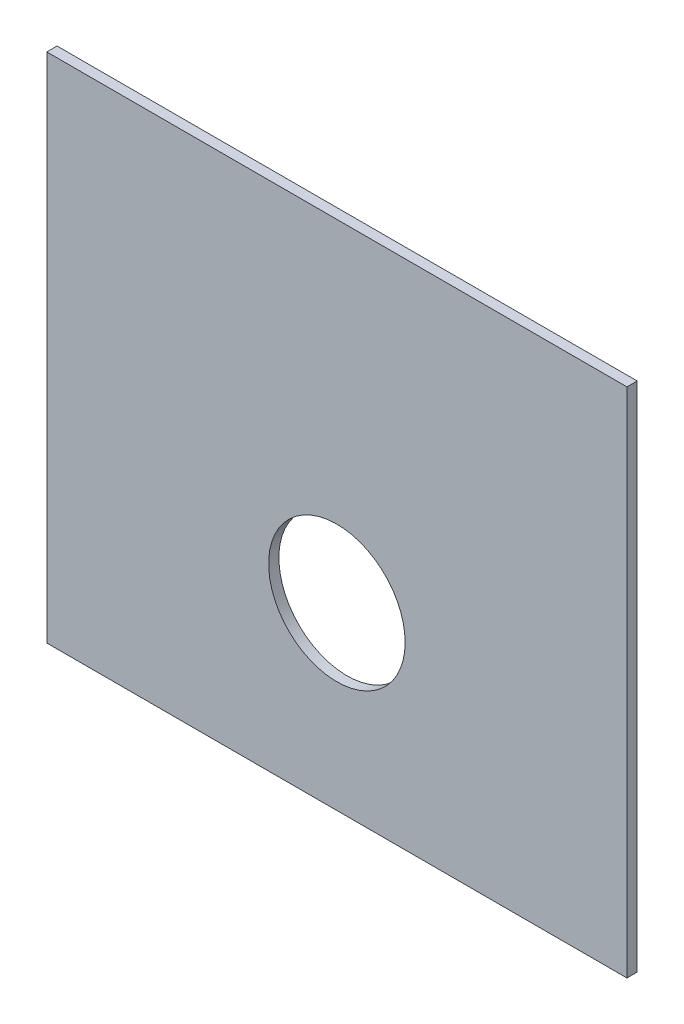
ISO-10303-21;
HEADER;
FILE_DESCRIPTION(('STEP AP214'),'2;1');
FILE_NAME('part.step','',(''),(''),'','','');
FILE_SCHEMA(('AUTOMOTIVE_DESIGN { 1 0 10303 214 1 1 1 1 }'));
ENDSEC;
DATA;
#1=APPLICATION_CONTEXT('core data for automotive mechanical design processes');
#2=APPLICATION_PROTOCOL_DEFINITION('international standard','automotive_design',2000,#1);
#3=PRODUCT_CONTEXT('',#1,'mechanical');
#4=PRODUCT('Part','Part','',(#3));
#5=PRODUCT_RELATED_PRODUCT_CATEGORY('part','',(#4));
#6=PRODUCT_DEFINITION_FORMATION('','',#4);
#7=PRODUCT_DEFINITION_CONTEXT('part definition',#1,'design');
#8=PRODUCT_DEFINITION('design','',#6,#7);
#9=PRODUCT_DEFINITION_SHAPE('','',#8);
#10=(LENGTH_UNIT() NAMED_UNIT(*) SI_UNIT(.MILLI.,.METRE.));
#11=(NAMED_UNIT(*) PLANE_ANGLE_UNIT() SI_UNIT($,.RADIAN.));
#12=(NAMED_UNIT(*) SI_UNIT($,.STERADIAN.) SOLID_ANGLE_UNIT());
#13=UNCERTAINTY_MEASURE_WITH_UNIT(LENGTH_MEASURE(1.E-05),#10,'distance_accuracy_value','');
#14=(GEOMETRIC_REPRESENTATION_CONTEXT(3) GLOBAL_UNCERTAINTY_ASSIGNED_CONTEXT((#13)) GLOBAL_UNIT_ASSIGNED_CONTEXT((#10,
#11,#12)) REPRESENTATION_CONTEXT('',''));
#15=CARTESIAN_POINT('',(0.,0.,0.));
#16=DIRECTION('',(0.,0.,1.));
#17=DIRECTION('',(1.,0.,0.));
#18=AXIS2_PLACEMENT_3D('',#15,#16,#17);
#19=CARTESIAN_POINT('',(0.,0.,3.));
#20=DIRECTION('',(1.,0.,0.));
#21=DIRECTION('',(0.,0.,-1.));
#22=AXIS2_PLACEMENT_3D('',#19,#20,#21);
#23=PLANE('',#22);
#24=DIRECTION('',(0.,-1.,0.));
#25=VECTOR('',#24,1.);
#26=CARTESIAN_POINT('',(0.,0.,0.));
#27=LINE('',#26,#25);
#28=CARTESIAN_POINT('',(0.,150.,0.));
#29=VERTEX_POINT('',#28);
#30=CARTESIAN_POINT('',(0.,0.,0.));
#31=VERTEX_POINT('',#30);
#32=EDGE_CURVE('E96',#29,#31,#27,.T.);
#33=ORIENTED_EDGE('',*,*,#32,.T.);
#34=DIRECTION('',(0.,0.,-1.));
#35=VECTOR('',#34,1.);
#36=CARTESIAN_POINT('',(0.,0.,3.));
#37=LINE('',#36,#35);
#38=CARTESIAN_POINT('',(0.,0.,3.));
#39=VERTEX_POINT('',#38);
#40=EDGE_CURVE('E11',#39,#31,#37,.T.);
#41=ORIENTED_EDGE('',*,*,#40,.F.);
#42=DIRECTION('',(0.,-1.,0.));
#43=VECTOR('',#42,1.);
#44=CARTESIAN_POINT('',(0.,0.,3.));
#45=LINE('',#44,#43);
#46=CARTESIAN_POINT('',(0.,150.,3.));
#47=VERTEX_POINT('',#46);
#48=EDGE_CURVE('E84',#47,#39,#45,.T.);
#49=ORIENTED_EDGE('',*,*,#48,.F.);
#50=DIRECTION('',(0.,0.,-1.));
#51=VECTOR('',#50,1.);
#52=CARTESIAN_POINT('',(0.,150.,3.));
#53=LINE('',#52,#51);
#54=EDGE_CURVE('E92',#47,#29,#53,.T.);
#55=ORIENTED_EDGE('',*,*,#54,.T.);
#56=EDGE_LOOP('',(#33,#41,#49,#55));
#57=FACE_BOUND('',#56,.T.);
#58=ADVANCED_FACE('F33',(#57),#23,.F.);
#59=CARTESIAN_POINT('',(0.,0.,3.));
#60=DIRECTION('',(0.,1.,0.));
#61=DIRECTION('',(0.,0.,1.));
#62=AXIS2_PLACEMENT_3D('',#59,#60,#61);
#63=PLANE('',#62);
#64=DIRECTION('',(1.,0.,0.));
#65=VECTOR('',#64,1.);
#66=CARTESIAN_POINT('',(0.,0.,0.));
#67=LINE('',#66,#65);
#68=CARTESIAN_POINT('',(170.,0.,0.));
#69=VERTEX_POINT('',#68);
#70=EDGE_CURVE('E88',#31,#69,#67,.T.);
#71=ORIENTED_EDGE('',*,*,#70,.T.);
#72=DIRECTION('',(0.,0.,-1.));
#73=VECTOR('',#72,1.);
#74=CARTESIAN_POINT('',(170.,0.,3.));
#75=LINE('',#74,#73);
#76=CARTESIAN_POINT('',(170.,0.,3.));
#77=VERTEX_POINT('',#76);
#78=EDGE_CURVE('E41',#77,#69,#75,.T.);
#79=ORIENTED_EDGE('',*,*,#78,.F.);
#80=DIRECTION('',(1.,0.,0.));
#81=VECTOR('',#80,1.);
#82=CARTESIAN_POINT('',(0.,0.,3.));
#83=LINE('',#82,#81);
#84=EDGE_CURVE('E79',#39,#77,#83,.T.);
#85=ORIENTED_EDGE('',*,*,#84,.F.);
#86=ORIENTED_EDGE('',*,*,#40,.T.);
#87=EDGE_LOOP('',(#71,#79,#85,#86));
#88=FACE_BOUND('',#87,.T.);
#89=ADVANCED_FACE('F87',(#88),#63,.F.);
#90=CARTESIAN_POINT('',(170.,0.,3.));
#91=DIRECTION('',(-1.,0.,0.));
#92=DIRECTION('',(0.,-1.,0.));
#93=AXIS2_PLACEMENT_3D('',#90,#91,#92);
#94=PLANE('',#93);
#95=DIRECTION('',(0.,1.,0.));
#96=VECTOR('',#95,1.);
#97=CARTESIAN_POINT('',(170.,0.,0.));
#98=LINE('',#97,#96);
#99=CARTESIAN_POINT('',(170.,150.,0.));
#100=VERTEX_POINT('',#99);
#101=EDGE_CURVE('E66',#69,#100,#98,.T.);
#102=ORIENTED_EDGE('',*,*,#101,.T.);
#103=DIRECTION('',(0.,0.,-1.));
#104=VECTOR('',#103,1.);
#105=CARTESIAN_POINT('',(170.,150.,3.));
#106=LINE('',#105,#104);
#107=CARTESIAN_POINT('',(170.,150.,3.));
#108=VERTEX_POINT('',#107);
#109=EDGE_CURVE('E89',#108,#100,#106,.T.);
#110=ORIENTED_EDGE('',*,*,#109,.F.);
#111=DIRECTION('',(0.,1.,0.));
#112=VECTOR('',#111,1.);
#113=CARTESIAN_POINT('',(170.,0.,3.));
#114=LINE('',#113,#112);
#115=EDGE_CURVE('E82',#77,#108,#114,.T.);
#116=ORIENTED_EDGE('',*,*,#115,.F.);
#117=ORIENTED_EDGE('',*,*,#78,.T.);
#118=EDGE_LOOP('',(#102,#110,#116,#117));
#119=FACE_BOUND('',#118,.T.);
#120=ADVANCED_FACE('F90',(#119),#94,.F.);
#121=CARTESIAN_POINT('',(0.,150.,3.));
#122=DIRECTION('',(0.,-1.,0.));
#123=DIRECTION('',(0.,0.,-1.));
#124=AXIS2_PLACEMENT_3D('',#121,#122,#123);
#125=PLANE('',#124);
#126=DIRECTION('',(-1.,0.,0.));
#127=VECTOR('',#126,1.);
#128=CARTESIAN_POINT('',(0.,150.,0.));
#129=LINE('',#128,#127);
#130=EDGE_CURVE('E72',#100,#29,#129,.T.);
#131=ORIENTED_EDGE('',*,*,#130,.T.);
#132=ORIENTED_EDGE('',*,*,#54,.F.);
#133=DIRECTION('',(-1.,0.,0.));
#134=VECTOR('',#133,1.);
#135=CARTESIAN_POINT('',(0.,150.,3.));
#136=LINE('',#135,#134);
#137=EDGE_CURVE('E49',#108,#47,#136,.T.);
#138=ORIENTED_EDGE('',*,*,#137,.F.);
#139=ORIENTED_EDGE('',*,*,#109,.T.);
#140=EDGE_LOOP('',(#131,#132,#138,#139));
#141=FACE_BOUND('',#140,.T.);
#142=ADVANCED_FACE('F104',(#141),#125,.F.);
#143=CARTESIAN_POINT('',(0.,0.,3.));
#144=DIRECTION('',(0.,0.,-1.));
#145=DIRECTION('',(-1.,0.,0.));
#146=AXIS2_PLACEMENT_3D('',#143,#144,#145);
#147=PLANE('',#146);
#148=CARTESIAN_POINT('',(85.,52.6642372525704,3.));
#149=DIRECTION('',(0.,0.,1.));
#150=DIRECTION('',(1.,0.,0.));
#151=AXIS2_PLACEMENT_3D('',#148,#149,#150);
#152=CIRCLE('',#151,20.);
#153=CARTESIAN_POINT('',(105.,52.6642372525704,3.));
#154=VERTEX_POINT('',#153);
#155=EDGE_CURVE('E110',#154,#154,#152,.T.);
#156=ORIENTED_EDGE('',*,*,#155,.F.);
#157=EDGE_LOOP('',(#156));
#158=FACE_BOUND('',#157,.T.);
#159=ORIENTED_EDGE('',*,*,#48,.T.);
#160=ORIENTED_EDGE('',*,*,#84,.T.);
#161=ORIENTED_EDGE('',*,*,#115,.T.);
#162=ORIENTED_EDGE('',*,*,#137,.T.);
#163=EDGE_LOOP('',(#159,#160,#161,#162));
#164=FACE_BOUND('',#163,.T.);
#165=ADVANCED_FACE('F80',(#158,#164),#147,.F.);
#166=CARTESIAN_POINT('',(0.,0.,0.));
#167=DIRECTION('',(0.,0.,-1.));
#168=DIRECTION('',(-1.,0.,0.));
#169=AXIS2_PLACEMENT_3D('',#166,#167,#168);
#170=PLANE('',#169);
#171=CARTESIAN_POINT('',(85.,52.6642372525704,0.));
#172=DIRECTION('',(0.,0.,1.));
#173=DIRECTION('',(1.,0.,0.));
#174=AXIS2_PLACEMENT_3D('',#171,#172,#173);
#175=CIRCLE('',#174,20.);
#176=CARTESIAN_POINT('',(105.,52.6642372525704,0.));
#177=VERTEX_POINT('',#176);
#178=EDGE_CURVE('E99',#177,#177,#175,.T.);
#179=ORIENTED_EDGE('',*,*,#178,.T.);
#180=EDGE_LOOP('',(#179));
#181=FACE_BOUND('',#180,.T.);
#182=ORIENTED_EDGE('',*,*,#32,.F.);
#183=ORIENTED_EDGE('',*,*,#130,.F.);
#184=ORIENTED_EDGE('',*,*,#101,.F.);
#185=ORIENTED_EDGE('',*,*,#70,.F.);
#186=EDGE_LOOP('',(#182,#183,#184,#185));
#187=FACE_BOUND('',#186,.T.);
#188=ADVANCED_FACE('F107',(#181,#187),#170,.T.);
#189=CARTESIAN_POINT('',(85.,52.6642372525704,0.));
#190=DIRECTION('',(0.,0.,1.));
#191=DIRECTION('',(1.,0.,0.));
#192=AXIS2_PLACEMENT_3D('',#189,#190,#191);
#193=CYLINDRICAL_SURFACE('',#192,20.);
#194=ORIENTED_EDGE('',*,*,#178,.F.);
#195=EDGE_LOOP('',(#194));
#196=FACE_BOUND('',#195,.T.);
#197=ORIENTED_EDGE('',*,*,#155,.T.);
#198=EDGE_LOOP('',(#197));
#199=FACE_BOUND('',#198,.T.);
#200=ADVANCED_FACE('F117',(#196,#199),#193,.F.);
#201=CLOSED_SHELL('',(#58,#89,#120,#142,#165,#188,#200));
#202=MANIFOLD_SOLID_BREP('B2',#201);
#203=ADVANCED_BREP_SHAPE_REPRESENTATION('',(#18,#202),#14);
#204=SHAPE_DEFINITION_REPRESENTATION(#9,#203);
ENDSEC;
END-ISO-10303-21;
